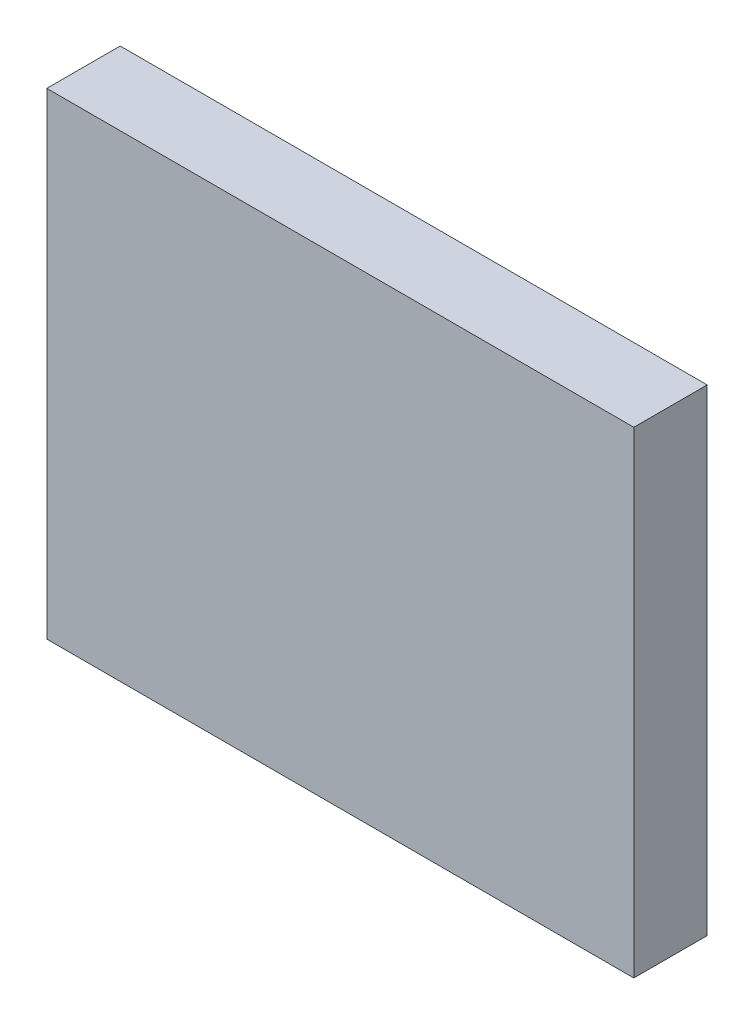
ISO-10303-21;
HEADER;
FILE_DESCRIPTION(('STEP AP214'),'2;1');
FILE_NAME('part.step','',(''),(''),'','','');
FILE_SCHEMA(('AUTOMOTIVE_DESIGN { 1 0 10303 214 1 1 1 1 }'));
ENDSEC;
DATA;
#1=APPLICATION_CONTEXT('core data for automotive mechanical design processes');
#2=APPLICATION_PROTOCOL_DEFINITION('international standard','automotive_design',2000,#1);
#3=PRODUCT_CONTEXT('',#1,'mechanical');
#4=PRODUCT('Part','Part','',(#3));
#5=PRODUCT_RELATED_PRODUCT_CATEGORY('part','',(#4));
#6=PRODUCT_DEFINITION_FORMATION('','',#4);
#7=PRODUCT_DEFINITION_CONTEXT('part definition',#1,'design');
#8=PRODUCT_DEFINITION('design','',#6,#7);
#9=PRODUCT_DEFINITION_SHAPE('','',#8);
#10=(LENGTH_UNIT() NAMED_UNIT(*) SI_UNIT(.MILLI.,.METRE.));
#11=(NAMED_UNIT(*) PLANE_ANGLE_UNIT() SI_UNIT($,.RADIAN.));
#12=(NAMED_UNIT(*) SI_UNIT($,.STERADIAN.) SOLID_ANGLE_UNIT());
#13=UNCERTAINTY_MEASURE_WITH_UNIT(LENGTH_MEASURE(1.E-05),#10,'distance_accuracy_value','');
#14=(GEOMETRIC_REPRESENTATION_CONTEXT(3) GLOBAL_UNCERTAINTY_ASSIGNED_CONTEXT((#13)) GLOBAL_UNIT_ASSIGNED_CONTEXT((#10,
#11,#12)) REPRESENTATION_CONTEXT('',''));
#15=CARTESIAN_POINT('',(0.,0.,0.));
#16=DIRECTION('',(0.,0.,1.));
#17=DIRECTION('',(1.,0.,0.));
#18=AXIS2_PLACEMENT_3D('',#15,#16,#17);
#19=CARTESIAN_POINT('',(0.,0.,20.));
#20=DIRECTION('',(-1.,0.,0.));
#21=DIRECTION('',(0.,0.,1.));
#22=AXIS2_PLACEMENT_3D('',#19,#20,#21);
#23=PLANE('',#22);
#24=DIRECTION('',(0.,1.,0.));
#25=VECTOR('',#24,1.);
#26=CARTESIAN_POINT('',(0.,0.,0.));
#27=LINE('',#26,#25);
#28=CARTESIAN_POINT('',(0.,0.,0.));
#29=VERTEX_POINT('',#28);
#30=CARTESIAN_POINT('',(0.,130.,0.));
#31=VERTEX_POINT('',#30);
#32=EDGE_CURVE('E190',#29,#31,#27,.T.);
#33=ORIENTED_EDGE('',*,*,#32,.T.);
#34=DIRECTION('',(0.,0.,-1.));
#35=VECTOR('',#34,1.);
#36=CARTESIAN_POINT('',(0.,130.,20.));
#37=LINE('',#36,#35);
#38=CARTESIAN_POINT('',(0.,130.,20.));
#39=VERTEX_POINT('',#38);
#40=EDGE_CURVE('E11',#39,#31,#37,.T.);
#41=ORIENTED_EDGE('',*,*,#40,.F.);
#42=DIRECTION('',(0.,1.,0.));
#43=VECTOR('',#42,1.);
#44=CARTESIAN_POINT('',(0.,0.,20.));
#45=LINE('',#44,#43);
#46=CARTESIAN_POINT('',(0.,0.,20.));
#47=VERTEX_POINT('',#46);
#48=EDGE_CURVE('E202',#47,#39,#45,.T.);
#49=ORIENTED_EDGE('',*,*,#48,.F.);
#50=DIRECTION('',(0.,0.,-1.));
#51=VECTOR('',#50,1.);
#52=CARTESIAN_POINT('',(0.,0.,20.));
#53=LINE('',#52,#51);
#54=EDGE_CURVE('E208',#47,#29,#53,.T.);
#55=ORIENTED_EDGE('',*,*,#54,.T.);
#56=EDGE_LOOP('',(#33,#41,#49,#55));
#57=FACE_BOUND('',#56,.T.);
#58=ADVANCED_FACE('F34',(#57),#23,.F.);
#59=CARTESIAN_POINT('',(0.,130.,20.));
#60=DIRECTION('',(0.,-1.,0.));
#61=DIRECTION('',(1.,0.,0.));
#62=AXIS2_PLACEMENT_3D('',#59,#60,#61);
#63=PLANE('',#62);
#64=DIRECTION('',(-1.,0.,0.));
#65=VECTOR('',#64,1.);
#66=CARTESIAN_POINT('',(0.,130.,0.));
#67=LINE('',#66,#65);
#68=CARTESIAN_POINT('',(-160.,130.,0.));
#69=VERTEX_POINT('',#68);
#70=EDGE_CURVE('E211',#31,#69,#67,.T.);
#71=ORIENTED_EDGE('',*,*,#70,.T.);
#72=DIRECTION('',(0.,0.,-1.));
#73=VECTOR('',#72,1.);
#74=CARTESIAN_POINT('',(-160.,130.,20.));
#75=LINE('',#74,#73);
#76=CARTESIAN_POINT('',(-160.,130.,20.));
#77=VERTEX_POINT('',#76);
#78=EDGE_CURVE('E41',#77,#69,#75,.T.);
#79=ORIENTED_EDGE('',*,*,#78,.F.);
#80=DIRECTION('',(-1.,0.,0.));
#81=VECTOR('',#80,1.);
#82=CARTESIAN_POINT('',(0.,130.,20.));
#83=LINE('',#82,#81);
#84=EDGE_CURVE('E85',#39,#77,#83,.T.);
#85=ORIENTED_EDGE('',*,*,#84,.F.);
#86=ORIENTED_EDGE('',*,*,#40,.T.);
#87=EDGE_LOOP('',(#71,#79,#85,#86));
#88=FACE_BOUND('',#87,.T.);
#89=ADVANCED_FACE('F239',(#88),#63,.F.);
#90=CARTESIAN_POINT('',(-160.,0.,20.));
#91=DIRECTION('',(1.,0.,0.));
#92=DIRECTION('',(0.,0.,-1.));
#93=AXIS2_PLACEMENT_3D('',#90,#91,#92);
#94=PLANE('',#93);
#95=DIRECTION('',(0.,-1.,0.));
#96=VECTOR('',#95,1.);
#97=CARTESIAN_POINT('',(-160.,0.,0.));
#98=LINE('',#97,#96);
#99=CARTESIAN_POINT('',(-160.,0.,0.));
#100=VERTEX_POINT('',#99);
#101=EDGE_CURVE('E213',#69,#100,#98,.T.);
#102=ORIENTED_EDGE('',*,*,#101,.T.);
#103=DIRECTION('',(0.,0.,-1.));
#104=VECTOR('',#103,1.);
#105=CARTESIAN_POINT('',(-160.,0.,20.));
#106=LINE('',#105,#104);
#107=CARTESIAN_POINT('',(-160.,0.,20.));
#108=VERTEX_POINT('',#107);
#109=EDGE_CURVE('E217',#108,#100,#106,.T.);
#110=ORIENTED_EDGE('',*,*,#109,.F.);
#111=DIRECTION('',(0.,-1.,0.));
#112=VECTOR('',#111,1.);
#113=CARTESIAN_POINT('',(-160.,0.,20.));
#114=LINE('',#113,#112);
#115=EDGE_CURVE('E205',#77,#108,#114,.T.);
#116=ORIENTED_EDGE('',*,*,#115,.F.);
#117=ORIENTED_EDGE('',*,*,#78,.T.);
#118=EDGE_LOOP('',(#102,#110,#116,#117));
#119=FACE_BOUND('',#118,.T.);
#120=ADVANCED_FACE('F222',(#119),#94,.F.);
#121=CARTESIAN_POINT('',(0.,0.,20.));
#122=DIRECTION('',(0.,1.,0.));
#123=DIRECTION('',(-1.,0.,0.));
#124=AXIS2_PLACEMENT_3D('',#121,#122,#123);
#125=PLANE('',#124);
#126=DIRECTION('',(1.,0.,0.));
#127=VECTOR('',#126,1.);
#128=CARTESIAN_POINT('',(0.,0.,0.));
#129=LINE('',#128,#127);
#130=EDGE_CURVE('E78',#100,#29,#129,.T.);
#131=ORIENTED_EDGE('',*,*,#130,.T.);
#132=ORIENTED_EDGE('',*,*,#54,.F.);
#133=DIRECTION('',(1.,0.,0.));
#134=VECTOR('',#133,1.);
#135=CARTESIAN_POINT('',(0.,0.,20.));
#136=LINE('',#135,#134);
#137=EDGE_CURVE('E57',#108,#47,#136,.T.);
#138=ORIENTED_EDGE('',*,*,#137,.F.);
#139=ORIENTED_EDGE('',*,*,#109,.T.);
#140=EDGE_LOOP('',(#131,#132,#138,#139));
#141=FACE_BOUND('',#140,.T.);
#142=ADVANCED_FACE('F230',(#141),#125,.F.);
#143=CARTESIAN_POINT('',(0.,0.,20.));
#144=DIRECTION('',(0.,0.,1.));
#145=DIRECTION('',(1.,0.,0.));
#146=AXIS2_PLACEMENT_3D('',#143,#144,#145);
#147=PLANE('',#146);
#148=ORIENTED_EDGE('',*,*,#48,.T.);
#149=ORIENTED_EDGE('',*,*,#84,.T.);
#150=ORIENTED_EDGE('',*,*,#115,.T.);
#151=ORIENTED_EDGE('',*,*,#137,.T.);
#152=EDGE_LOOP('',(#148,#149,#150,#151));
#153=FACE_BOUND('',#152,.T.);
#154=ADVANCED_FACE('F232',(#153),#147,.T.);
#155=CARTESIAN_POINT('',(0.,0.,0.));
#156=DIRECTION('',(0.,0.,1.));
#157=DIRECTION('',(1.,0.,0.));
#158=AXIS2_PLACEMENT_3D('',#155,#156,#157);
#159=PLANE('',#158);
#160=DIRECTION('',(0.,1.,0.));
#161=VECTOR('',#160,1.);
#162=CARTESIAN_POINT('',(-150.,110.,0.));
#163=LINE('',#162,#161);
#164=CARTESIAN_POINT('',(-150.,20.,0.));
#165=VERTEX_POINT('',#164);
#166=CARTESIAN_POINT('',(-150.,110.,0.));
#167=VERTEX_POINT('',#166);
#168=EDGE_CURVE('E172',#165,#167,#163,.T.);
#169=ORIENTED_EDGE('',*,*,#168,.F.);
#170=CARTESIAN_POINT('',(-140.,20.,0.));
#171=DIRECTION('',(0.,0.,-1.));
#172=DIRECTION('',(-1.,0.,0.));
#173=AXIS2_PLACEMENT_3D('',#170,#171,#172);
#174=CIRCLE('',#173,9.99999999999999);
#175=CARTESIAN_POINT('',(-140.,9.99999999999998,0.));
#176=VERTEX_POINT('',#175);
#177=EDGE_CURVE('E48',#176,#165,#174,.T.);
#178=ORIENTED_EDGE('',*,*,#177,.F.);
#179=DIRECTION('',(-1.,0.,0.));
#180=VECTOR('',#179,1.);
#181=CARTESIAN_POINT('',(-140.,9.99999999999998,0.));
#182=LINE('',#181,#180);
#183=CARTESIAN_POINT('',(-20.,9.99999999999999,0.));
#184=VERTEX_POINT('',#183);
#185=EDGE_CURVE('E152',#184,#176,#182,.T.);
#186=ORIENTED_EDGE('',*,*,#185,.F.);
#187=CARTESIAN_POINT('',(-20.,20.,0.));
#188=DIRECTION('',(0.,0.,-1.));
#189=DIRECTION('',(-1.,0.,0.));
#190=AXIS2_PLACEMENT_3D('',#187,#188,#189);
#191=CIRCLE('',#190,10.);
#192=CARTESIAN_POINT('',(-9.99999999999998,20.,0.));
#193=VERTEX_POINT('',#192);
#194=EDGE_CURVE('E155',#193,#184,#191,.T.);
#195=ORIENTED_EDGE('',*,*,#194,.F.);
#196=DIRECTION('',(0.,-1.,0.));
#197=VECTOR('',#196,1.);
#198=CARTESIAN_POINT('',(-9.99999999999998,20.,0.));
#199=LINE('',#198,#197);
#200=CARTESIAN_POINT('',(-10.,110.,0.));
#201=VERTEX_POINT('',#200);
#202=EDGE_CURVE('E183',#201,#193,#199,.T.);
#203=ORIENTED_EDGE('',*,*,#202,.F.);
#204=CARTESIAN_POINT('',(-20.,110.,0.));
#205=DIRECTION('',(0.,0.,-1.));
#206=DIRECTION('',(-1.,0.,0.));
#207=AXIS2_PLACEMENT_3D('',#204,#205,#206);
#208=CIRCLE('',#207,9.99999999999999);
#209=CARTESIAN_POINT('',(-20.,120.,0.));
#210=VERTEX_POINT('',#209);
#211=EDGE_CURVE('E180',#210,#201,#208,.T.);
#212=ORIENTED_EDGE('',*,*,#211,.F.);
#213=DIRECTION('',(1.,0.,0.));
#214=VECTOR('',#213,1.);
#215=CARTESIAN_POINT('',(-20.,120.,0.));
#216=LINE('',#215,#214);
#217=CARTESIAN_POINT('',(-140.,120.,0.));
#218=VERTEX_POINT('',#217);
#219=EDGE_CURVE('E177',#218,#210,#216,.T.);
#220=ORIENTED_EDGE('',*,*,#219,.F.);
#221=CARTESIAN_POINT('',(-140.,110.,0.));
#222=DIRECTION('',(0.,0.,-1.));
#223=DIRECTION('',(-1.,0.,0.));
#224=AXIS2_PLACEMENT_3D('',#221,#222,#223);
#225=CIRCLE('',#224,9.99999999999999);
#226=EDGE_CURVE('E174',#167,#218,#225,.T.);
#227=ORIENTED_EDGE('',*,*,#226,.F.);
#228=EDGE_LOOP('',(#169,#178,#186,#195,#203,#212,#220,#227));
#229=FACE_BOUND('',#228,.T.);
#230=ORIENTED_EDGE('',*,*,#32,.F.);
#231=ORIENTED_EDGE('',*,*,#130,.F.);
#232=ORIENTED_EDGE('',*,*,#101,.F.);
#233=ORIENTED_EDGE('',*,*,#70,.F.);
#234=EDGE_LOOP('',(#230,#231,#232,#233));
#235=FACE_BOUND('',#234,.T.);
#236=ADVANCED_FACE('F226',(#229,#235),#159,.F.);
#237=CARTESIAN_POINT('',(-140.,20.,10.));
#238=DIRECTION('',(0.,0.,-1.));
#239=DIRECTION('',(-1.,0.,0.));
#240=AXIS2_PLACEMENT_3D('',#237,#238,#239);
#241=CYLINDRICAL_SURFACE('',#240,9.99999999999999);
#242=ORIENTED_EDGE('',*,*,#177,.T.);
#243=DIRECTION('',(0.,0.,-1.));
#244=VECTOR('',#243,1.);
#245=CARTESIAN_POINT('',(-150.,20.,10.));
#246=LINE('',#245,#244);
#247=CARTESIAN_POINT('',(-150.,20.,10.));
#248=VERTEX_POINT('',#247);
#249=EDGE_CURVE('E129',#248,#165,#246,.T.);
#250=ORIENTED_EDGE('',*,*,#249,.F.);
#251=CARTESIAN_POINT('',(-140.,20.,10.));
#252=DIRECTION('',(0.,0.,-1.));
#253=DIRECTION('',(-1.,0.,0.));
#254=AXIS2_PLACEMENT_3D('',#251,#252,#253);
#255=CIRCLE('',#254,9.99999999999999);
#256=CARTESIAN_POINT('',(-140.,9.99999999999998,10.));
#257=VERTEX_POINT('',#256);
#258=EDGE_CURVE('E133',#257,#248,#255,.T.);
#259=ORIENTED_EDGE('',*,*,#258,.F.);
#260=DIRECTION('',(0.,0.,-1.));
#261=VECTOR('',#260,1.);
#262=CARTESIAN_POINT('',(-140.,9.99999999999998,10.));
#263=LINE('',#262,#261);
#264=EDGE_CURVE('E188',#257,#176,#263,.T.);
#265=ORIENTED_EDGE('',*,*,#264,.T.);
#266=EDGE_LOOP('',(#242,#250,#259,#265));
#267=FACE_BOUND('',#266,.T.);
#268=ADVANCED_FACE('F131',(#267),#241,.F.);
#269=CARTESIAN_POINT('',(-140.,9.99999999999998,10.));
#270=DIRECTION('',(0.,-1.,0.));
#271=DIRECTION('',(1.,0.,0.));
#272=AXIS2_PLACEMENT_3D('',#269,#270,#271);
#273=PLANE('',#272);
#274=ORIENTED_EDGE('',*,*,#185,.T.);
#275=ORIENTED_EDGE('',*,*,#264,.F.);
#276=DIRECTION('',(-1.,0.,0.));
#277=VECTOR('',#276,1.);
#278=CARTESIAN_POINT('',(-140.,9.99999999999998,10.));
#279=LINE('',#278,#277);
#280=CARTESIAN_POINT('',(-20.,9.99999999999999,10.));
#281=VERTEX_POINT('',#280);
#282=EDGE_CURVE('E139',#281,#257,#279,.T.);
#283=ORIENTED_EDGE('',*,*,#282,.F.);
#284=DIRECTION('',(0.,0.,-1.));
#285=VECTOR('',#284,1.);
#286=CARTESIAN_POINT('',(-20.,9.99999999999999,10.));
#287=LINE('',#286,#285);
#288=EDGE_CURVE('E191',#281,#184,#287,.T.);
#289=ORIENTED_EDGE('',*,*,#288,.T.);
#290=EDGE_LOOP('',(#274,#275,#283,#289));
#291=FACE_BOUND('',#290,.T.);
#292=ADVANCED_FACE('F279',(#291),#273,.F.);
#293=CARTESIAN_POINT('',(-20.,20.,10.));
#294=DIRECTION('',(0.,0.,-1.));
#295=DIRECTION('',(-1.,0.,0.));
#296=AXIS2_PLACEMENT_3D('',#293,#294,#295);
#297=CYLINDRICAL_SURFACE('',#296,10.);
#298=ORIENTED_EDGE('',*,*,#194,.T.);
#299=ORIENTED_EDGE('',*,*,#288,.F.);
#300=CARTESIAN_POINT('',(-20.,20.,10.));
#301=DIRECTION('',(0.,0.,-1.));
#302=DIRECTION('',(-1.,0.,0.));
#303=AXIS2_PLACEMENT_3D('',#300,#301,#302);
#304=CIRCLE('',#303,10.);
#305=CARTESIAN_POINT('',(-9.99999999999998,20.,10.));
#306=VERTEX_POINT('',#305);
#307=EDGE_CURVE('E168',#306,#281,#304,.T.);
#308=ORIENTED_EDGE('',*,*,#307,.F.);
#309=DIRECTION('',(0.,0.,-1.));
#310=VECTOR('',#309,1.);
#311=CARTESIAN_POINT('',(-9.99999999999998,20.,10.));
#312=LINE('',#311,#310);
#313=EDGE_CURVE('E193',#306,#193,#312,.T.);
#314=ORIENTED_EDGE('',*,*,#313,.T.);
#315=EDGE_LOOP('',(#298,#299,#308,#314));
#316=FACE_BOUND('',#315,.T.);
#317=ADVANCED_FACE('F288',(#316),#297,.F.);
#318=CARTESIAN_POINT('',(-9.99999999999998,20.,10.));
#319=DIRECTION('',(1.,0.,0.));
#320=DIRECTION('',(0.,1.,0.));
#321=AXIS2_PLACEMENT_3D('',#318,#319,#320);
#322=PLANE('',#321);
#323=ORIENTED_EDGE('',*,*,#202,.T.);
#324=ORIENTED_EDGE('',*,*,#313,.F.);
#325=DIRECTION('',(0.,-1.,0.));
#326=VECTOR('',#325,1.);
#327=CARTESIAN_POINT('',(-9.99999999999998,20.,10.));
#328=LINE('',#327,#326);
#329=CARTESIAN_POINT('',(-10.,110.,10.));
#330=VERTEX_POINT('',#329);
#331=EDGE_CURVE('E165',#330,#306,#328,.T.);
#332=ORIENTED_EDGE('',*,*,#331,.F.);
#333=DIRECTION('',(0.,0.,-1.));
#334=VECTOR('',#333,1.);
#335=CARTESIAN_POINT('',(-10.,110.,10.));
#336=LINE('',#335,#334);
#337=EDGE_CURVE('E195',#330,#201,#336,.T.);
#338=ORIENTED_EDGE('',*,*,#337,.T.);
#339=EDGE_LOOP('',(#323,#324,#332,#338));
#340=FACE_BOUND('',#339,.T.);
#341=ADVANCED_FACE('F298',(#340),#322,.F.);
#342=CARTESIAN_POINT('',(-20.,110.,10.));
#343=DIRECTION('',(0.,0.,-1.));
#344=DIRECTION('',(-1.,0.,0.));
#345=AXIS2_PLACEMENT_3D('',#342,#343,#344);
#346=CYLINDRICAL_SURFACE('',#345,9.99999999999999);
#347=ORIENTED_EDGE('',*,*,#211,.T.);
#348=ORIENTED_EDGE('',*,*,#337,.F.);
#349=CARTESIAN_POINT('',(-20.,110.,10.));
#350=DIRECTION('',(0.,0.,-1.));
#351=DIRECTION('',(-1.,0.,0.));
#352=AXIS2_PLACEMENT_3D('',#349,#350,#351);
#353=CIRCLE('',#352,9.99999999999999);
#354=CARTESIAN_POINT('',(-20.,120.,10.));
#355=VERTEX_POINT('',#354);
#356=EDGE_CURVE('E162',#355,#330,#353,.T.);
#357=ORIENTED_EDGE('',*,*,#356,.F.);
#358=DIRECTION('',(0.,0.,-1.));
#359=VECTOR('',#358,1.);
#360=CARTESIAN_POINT('',(-20.,120.,10.));
#361=LINE('',#360,#359);
#362=EDGE_CURVE('E197',#355,#210,#361,.T.);
#363=ORIENTED_EDGE('',*,*,#362,.T.);
#364=EDGE_LOOP('',(#347,#348,#357,#363));
#365=FACE_BOUND('',#364,.T.);
#366=ADVANCED_FACE('F308',(#365),#346,.F.);
#367=CARTESIAN_POINT('',(-20.,120.,10.));
#368=DIRECTION('',(0.,1.,0.));
#369=DIRECTION('',(-1.,0.,0.));
#370=AXIS2_PLACEMENT_3D('',#367,#368,#369);
#371=PLANE('',#370);
#372=ORIENTED_EDGE('',*,*,#219,.T.);
#373=ORIENTED_EDGE('',*,*,#362,.F.);
#374=DIRECTION('',(1.,0.,0.));
#375=VECTOR('',#374,1.);
#376=CARTESIAN_POINT('',(-20.,120.,10.));
#377=LINE('',#376,#375);
#378=CARTESIAN_POINT('',(-140.,120.,10.));
#379=VERTEX_POINT('',#378);
#380=EDGE_CURVE('E159',#379,#355,#377,.T.);
#381=ORIENTED_EDGE('',*,*,#380,.F.);
#382=DIRECTION('',(0.,0.,-1.));
#383=VECTOR('',#382,1.);
#384=CARTESIAN_POINT('',(-140.,120.,10.));
#385=LINE('',#384,#383);
#386=EDGE_CURVE('E199',#379,#218,#385,.T.);
#387=ORIENTED_EDGE('',*,*,#386,.T.);
#388=EDGE_LOOP('',(#372,#373,#381,#387));
#389=FACE_BOUND('',#388,.T.);
#390=ADVANCED_FACE('F318',(#389),#371,.F.);
#391=CARTESIAN_POINT('',(-140.,110.,10.));
#392=DIRECTION('',(0.,0.,-1.));
#393=DIRECTION('',(-1.,0.,0.));
#394=AXIS2_PLACEMENT_3D('',#391,#392,#393);
#395=CYLINDRICAL_SURFACE('',#394,9.99999999999999);
#396=ORIENTED_EDGE('',*,*,#226,.T.);
#397=ORIENTED_EDGE('',*,*,#386,.F.);
#398=CARTESIAN_POINT('',(-140.,110.,10.));
#399=DIRECTION('',(0.,0.,-1.));
#400=DIRECTION('',(-1.,0.,0.));
#401=AXIS2_PLACEMENT_3D('',#398,#399,#400);
#402=CIRCLE('',#401,9.99999999999999);
#403=CARTESIAN_POINT('',(-150.,110.,10.));
#404=VERTEX_POINT('',#403);
#405=EDGE_CURVE('E147',#404,#379,#402,.T.);
#406=ORIENTED_EDGE('',*,*,#405,.F.);
#407=DIRECTION('',(0.,0.,-1.));
#408=VECTOR('',#407,1.);
#409=CARTESIAN_POINT('',(-150.,110.,10.));
#410=LINE('',#409,#408);
#411=EDGE_CURVE('E138',#404,#167,#410,.T.);
#412=ORIENTED_EDGE('',*,*,#411,.T.);
#413=EDGE_LOOP('',(#396,#397,#406,#412));
#414=FACE_BOUND('',#413,.T.);
#415=ADVANCED_FACE('F328',(#414),#395,.F.);
#416=CARTESIAN_POINT('',(-150.,110.,10.));
#417=DIRECTION('',(-1.,0.,0.));
#418=DIRECTION('',(0.,0.,1.));
#419=AXIS2_PLACEMENT_3D('',#416,#417,#418);
#420=PLANE('',#419);
#421=ORIENTED_EDGE('',*,*,#168,.T.);
#422=ORIENTED_EDGE('',*,*,#411,.F.);
#423=DIRECTION('',(0.,1.,0.));
#424=VECTOR('',#423,1.);
#425=CARTESIAN_POINT('',(-150.,110.,10.));
#426=LINE('',#425,#424);
#427=EDGE_CURVE('E142',#248,#404,#426,.T.);
#428=ORIENTED_EDGE('',*,*,#427,.F.);
#429=ORIENTED_EDGE('',*,*,#249,.T.);
#430=EDGE_LOOP('',(#421,#422,#428,#429));
#431=FACE_BOUND('',#430,.T.);
#432=ADVANCED_FACE('F143',(#431),#420,.F.);
#433=CARTESIAN_POINT('',(-140.,20.,10.));
#434=DIRECTION('',(0.,0.,-1.));
#435=DIRECTION('',(-1.,0.,0.));
#436=AXIS2_PLACEMENT_3D('',#433,#434,#435);
#437=PLANE('',#436);
#438=ORIENTED_EDGE('',*,*,#258,.T.);
#439=ORIENTED_EDGE('',*,*,#427,.T.);
#440=ORIENTED_EDGE('',*,*,#405,.T.);
#441=ORIENTED_EDGE('',*,*,#380,.T.);
#442=ORIENTED_EDGE('',*,*,#356,.T.);
#443=ORIENTED_EDGE('',*,*,#331,.T.);
#444=ORIENTED_EDGE('',*,*,#307,.T.);
#445=ORIENTED_EDGE('',*,*,#282,.T.);
#446=EDGE_LOOP('',(#438,#439,#440,#441,#442,#443,#444,#445));
#447=FACE_BOUND('',#446,.T.);
#448=ADVANCED_FACE('F149',(#447),#437,.T.);
#449=CLOSED_SHELL('',(#58,#89,#120,#142,#154,#236,#268,#292,#317,#341,#366,#390,#415,#432,#448));
#450=MANIFOLD_SOLID_BREP('B2',#449);
#451=ADVANCED_BREP_SHAPE_REPRESENTATION('',(#18,#450),#14);
#452=SHAPE_DEFINITION_REPRESENTATION(#9,#451);
ENDSEC;
END-ISO-10303-21;
